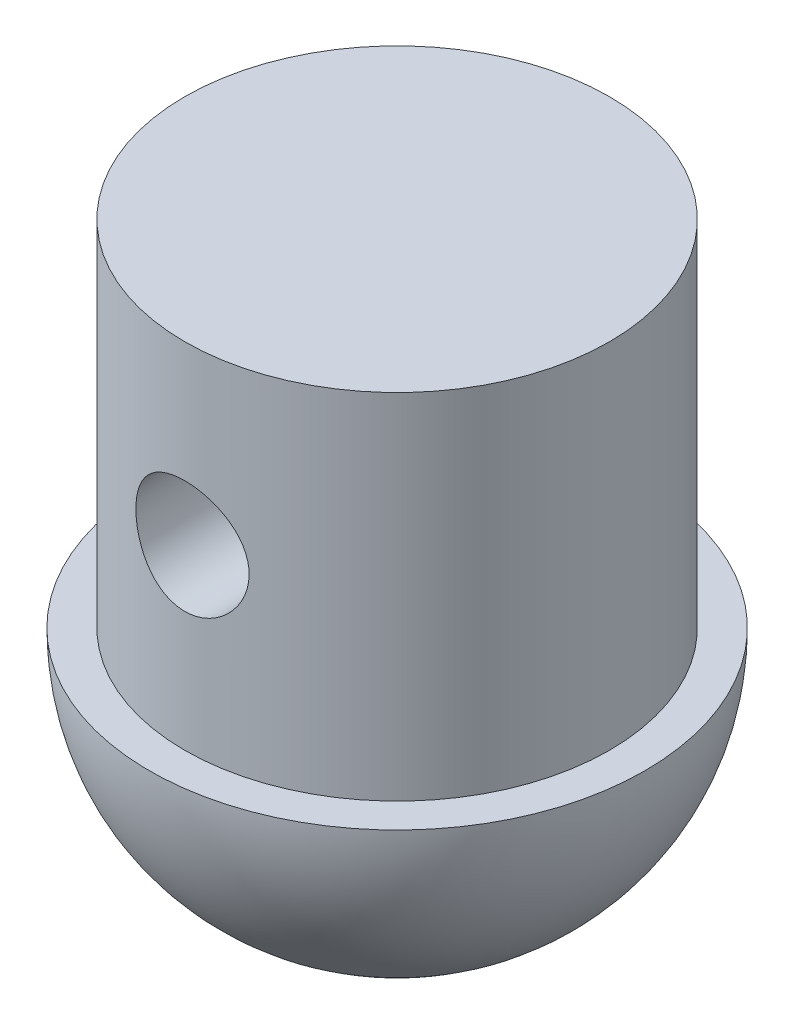
ISO-10303-21;
HEADER;
FILE_DESCRIPTION(('STEP AP214'),'2;1');
FILE_NAME('part.step','',(''),(''),'','','');
FILE_SCHEMA(('AUTOMOTIVE_DESIGN { 1 0 10303 214 1 1 1 1 }'));
ENDSEC;
DATA;
#1=APPLICATION_CONTEXT('core data for automotive mechanical design processes');
#2=APPLICATION_PROTOCOL_DEFINITION('international standard','automotive_design',2000,#1);
#3=PRODUCT_CONTEXT('',#1,'mechanical');
#4=PRODUCT('Part','Part','',(#3));
#5=PRODUCT_RELATED_PRODUCT_CATEGORY('part','',(#4));
#6=PRODUCT_DEFINITION_FORMATION('','',#4);
#7=PRODUCT_DEFINITION_CONTEXT('part definition',#1,'design');
#8=PRODUCT_DEFINITION('design','',#6,#7);
#9=PRODUCT_DEFINITION_SHAPE('','',#8);
#10=(LENGTH_UNIT() NAMED_UNIT(*) SI_UNIT(.MILLI.,.METRE.));
#11=(NAMED_UNIT(*) PLANE_ANGLE_UNIT() SI_UNIT($,.RADIAN.));
#12=(NAMED_UNIT(*) SI_UNIT($,.STERADIAN.) SOLID_ANGLE_UNIT());
#13=UNCERTAINTY_MEASURE_WITH_UNIT(LENGTH_MEASURE(1.E-05),#10,'distance_accuracy_value','');
#14=(GEOMETRIC_REPRESENTATION_CONTEXT(3) GLOBAL_UNCERTAINTY_ASSIGNED_CONTEXT((#13)) GLOBAL_UNIT_ASSIGNED_CONTEXT((#10,
#11,#12)) REPRESENTATION_CONTEXT('',''));
#15=CARTESIAN_POINT('',(0.,0.,0.));
#16=DIRECTION('',(0.,0.,1.));
#17=DIRECTION('',(1.,0.,0.));
#18=AXIS2_PLACEMENT_3D('',#15,#16,#17);
#19=CARTESIAN_POINT('',(0.,0.,0.));
#20=DIRECTION('',(0.,1.,0.));
#21=DIRECTION('',(1.,0.,0.));
#22=AXIS2_PLACEMENT_3D('',#19,#20,#21);
#23=SPHERICAL_SURFACE('',#22,7.);
#24=CARTESIAN_POINT('',(0.,0.,0.));
#25=DIRECTION('',(-0.915664164822438,0.401944196699029,0.));
#26=DIRECTION('',(-0.401944196699029,-0.915664164822438,0.));
#27=AXIS2_PLACEMENT_3D('',#24,#25,#26);
#28=SPHERICAL_SURFACE('',#27,7.);
#29=CARTESIAN_POINT('',(-6.28184853391924,2.75750942294523,0.));
#30=DIRECTION('',(-0.915664164822438,0.401944196699029,0.));
#31=DIRECTION('',(-0.401944196699029,-0.915664164822438,0.));
#32=AXIS2_PLACEMENT_3D('',#29,#30,#31);
#33=CIRCLE('',#32,1.39087051132196);
#34=CARTESIAN_POINT('',(-6.84090086430491,1.48393913781945,0.));
#35=VERTEX_POINT('',#34);
#36=EDGE_CURVE('E11',#35,#35,#33,.T.);
#37=ORIENTED_EDGE('',*,*,#36,.T.);
#38=EDGE_LOOP('',(#37));
#39=FACE_BOUND('',#38,.T.);
#40=ADVANCED_FACE('F40',(#39),#28,.T.);
#41=CARTESIAN_POINT('',(-4.44764178502422,6.93599341309035,-7.));
#42=DIRECTION('',(-0.915664164822438,0.401944196699029,0.));
#43=DIRECTION('',(-0.401944196699029,-0.915664164822438,0.));
#44=AXIS2_PLACEMENT_3D('',#41,#42,#43);
#45=PLANE('',#44);
#46=ORIENTED_EDGE('',*,*,#36,.F.);
#47=EDGE_LOOP('',(#46));
#48=FACE_BOUND('',#47,.T.);
#49=ADVANCED_FACE('F48',(#48),#45,.F.);
#50=CLOSED_SHELL('',(#40,#49));
#51=MANIFOLD_SOLID_BREP('B2',#50);
#52=CARTESIAN_POINT('',(0.,0.,0.));
#53=DIRECTION('',(0.,1.,0.));
#54=DIRECTION('',(1.,0.,0.));
#55=AXIS2_PLACEMENT_3D('',#52,#53,#54);
#56=SPHERICAL_SURFACE('',#55,7.);
#57=CARTESIAN_POINT('',(0.,0.,0.));
#58=DIRECTION('',(0.,-1.,0.));
#59=DIRECTION('',(0.,0.,-1.));
#60=AXIS2_PLACEMENT_3D('',#57,#58,#59);
#61=CIRCLE('',#60,7.);
#62=CARTESIAN_POINT('',(0.,0.,-7.));
#63=VERTEX_POINT('',#62);
#64=EDGE_CURVE('E76',#63,#63,#61,.T.);
#65=ORIENTED_EDGE('',*,*,#64,.T.);
#66=EDGE_LOOP('',(#65));
#67=FACE_BOUND('',#66,.T.);
#68=ADVANCED_FACE('F65',(#67),#56,.T.);
#69=CARTESIAN_POINT('',(-7.49229768381106,0.,-7.));
#70=DIRECTION('',(0.,-1.,0.));
#71=DIRECTION('',(0.,0.,-1.));
#72=AXIS2_PLACEMENT_3D('',#69,#70,#71);
#73=PLANE('',#72);
#74=CARTESIAN_POINT('',(0.,0.,0.));
#75=DIRECTION('',(0.,-1.,0.));
#76=DIRECTION('',(0.,0.,-1.));
#77=AXIS2_PLACEMENT_3D('',#74,#75,#76);
#78=CIRCLE('',#77,6.);
#79=CARTESIAN_POINT('',(0.,0.,-6.));
#80=VERTEX_POINT('',#79);
#81=EDGE_CURVE('E39',#80,#80,#78,.F.);
#82=ORIENTED_EDGE('',*,*,#81,.F.);
#83=EDGE_LOOP('',(#82));
#84=FACE_BOUND('',#83,.T.);
#85=ORIENTED_EDGE('',*,*,#64,.F.);
#86=EDGE_LOOP('',(#85));
#87=FACE_BOUND('',#86,.T.);
#88=ADVANCED_FACE('F102',(#84,#87),#73,.F.);
#89=CARTESIAN_POINT('',(0.,10.,0.));
#90=DIRECTION('',(0.,-1.,0.));
#91=DIRECTION('',(0.,0.,-1.));
#92=AXIS2_PLACEMENT_3D('',#89,#90,#91);
#93=CYLINDRICAL_SURFACE('',#92,6.);
#94=CARTESIAN_POINT('',(0.,6.6,-6.));
#95=CARTESIAN_POINT('',(-0.0882036446662835,6.59999790645212,-5.9999986704813));
#96=CARTESIAN_POINT('',(-0.176429728177472,6.59268190864826,-5.99803588929723));
#97=CARTESIAN_POINT('',(-0.350340361083571,6.56366301540905,-5.99039658897325));
#98=CARTESIAN_POINT('',(-0.436023666655269,6.54195319645911,-5.98471828266059));
#99=CARTESIAN_POINT('',(-0.60231327123625,6.48490266650877,-5.97027466602242));
#100=CARTESIAN_POINT('',(-0.682925960812229,6.44957952986717,-5.96151333704337));
#101=CARTESIAN_POINT('',(-0.837082949114126,6.36637020586672,-5.94182959321305));
#102=CARTESIAN_POINT('',(-0.910626776359695,6.31848318131261,-5.93090703436005));
#103=CARTESIAN_POINT('',(-1.05026360299202,6.21033318686926,-5.90779691921738));
#104=CARTESIAN_POINT('',(-1.11616935189025,6.14983306559322,-5.8955877414348));
#105=CARTESIAN_POINT('',(-1.23702970928508,6.01868121354948,-5.87141927743138));
#106=CARTESIAN_POINT('',(-1.29198290796523,5.94802817790661,-5.85946002355797));
#107=CARTESIAN_POINT('',(-1.39029127394741,5.797081412139,-5.83692429973529));
#108=CARTESIAN_POINT('',(-1.43343102189222,5.71664293738822,-5.82637510858234));
#109=CARTESIAN_POINT('',(-1.50550038461563,5.54932791112846,-5.80817181846909));
#110=CARTESIAN_POINT('',(-1.53443261960976,5.46245255014382,-5.8005171857408));
#111=CARTESIAN_POINT('',(-1.5766153618114,5.28680356973868,-5.78919292669855));
#112=CARTESIAN_POINT('',(-1.59020536195949,5.19811716803828,-5.78543718352246));
#113=CARTESIAN_POINT('',(-1.60237627764874,5.01964985333367,-5.78207864835752));
#114=CARTESIAN_POINT('',(-1.60095999764589,4.92986914797151,-5.78247508038722));
#115=CARTESIAN_POINT('',(-1.58342808002097,4.7544116677021,-5.78729903015237));
#116=CARTESIAN_POINT('',(-1.56772324851795,4.66869025436957,-5.79161388402152));
#117=CARTESIAN_POINT('',(-1.52271798977763,4.50114533243464,-5.80360810471625));
#118=CARTESIAN_POINT('',(-1.493416475944,4.41932213593963,-5.81128774043995));
#119=CARTESIAN_POINT('',(-1.421714855722,4.26082548495324,-5.82924529396782));
#120=CARTESIAN_POINT('',(-1.37917072910226,4.18422052857102,-5.83955154254446));
#121=CARTESIAN_POINT('',(-1.28229203059023,4.03909267291875,-5.86158583714473));
#122=CARTESIAN_POINT('',(-1.22795513779401,3.97057136867482,-5.8733141628429));
#123=CARTESIAN_POINT('',(-1.10693285810735,3.84120880203617,-5.89734008503746));
#124=CARTESIAN_POINT('',(-1.03990250182639,3.78069094534804,-5.90964377191026));
#125=CARTESIAN_POINT('',(-0.896494134565098,3.67168897571977,-5.93309105021092));
#126=CARTESIAN_POINT('',(-0.820115755364072,3.62320533703806,-5.94423459590854));
#127=CARTESIAN_POINT('',(-0.659678604397961,3.53950567774028,-5.96417456318624));
#128=CARTESIAN_POINT('',(-0.575587922041431,3.50434818364113,-5.97296058266845));
#129=CARTESIAN_POINT('',(-0.402401835512316,3.4487622489493,-5.98712035520802));
#130=CARTESIAN_POINT('',(-0.313307529542658,3.42833058982083,-5.99249485386999));
#131=CARTESIAN_POINT('',(-0.135403266516412,3.40328409846574,-5.99911326846707));
#132=CARTESIAN_POINT('',(-0.0466593901131037,3.39822956811931,-6.00047197976769));
#133=CARTESIAN_POINT('',(0.130408036720958,3.40286653139755,-5.99923577353354));
#134=CARTESIAN_POINT('',(0.218731629649689,3.41255650088461,-5.99664126464274));
#135=CARTESIAN_POINT('',(0.390881959921425,3.44604675796799,-5.98786428396825));
#136=CARTESIAN_POINT('',(0.474759881622232,3.46960179695823,-5.98174421237093));
#137=CARTESIAN_POINT('',(0.637365576940845,3.52986875560634,-5.96661035915282));
#138=CARTESIAN_POINT('',(0.716092791372797,3.56658210100036,-5.9575962639682));
#139=CARTESIAN_POINT('',(0.867870779734386,3.6529391097445,-5.93740528447735));
#140=CARTESIAN_POINT('',(0.94078015076904,3.70282197343847,-5.92618949284386));
#141=CARTESIAN_POINT('',(1.07734770831762,3.81380130412612,-5.9028916189203));
#142=CARTESIAN_POINT('',(1.14100406303899,3.87489998607982,-5.89080936580444));
#143=CARTESIAN_POINT('',(1.25911139583055,4.0086284619967,-5.86671796694981));
#144=CARTESIAN_POINT('',(1.31325215399989,4.08153484912012,-5.85472049149563));
#145=CARTESIAN_POINT('',(1.40853752947959,4.23565175687572,-5.83253157740069));
#146=CARTESIAN_POINT('',(1.44968268897221,4.31686193088299,-5.82234006342218));
#147=CARTESIAN_POINT('',(1.51749929269189,4.48487624567057,-5.80503414721321));
#148=CARTESIAN_POINT('',(1.54425449804718,4.5716446494985,-5.79790198738987));
#149=CARTESIAN_POINT('',(1.58272964096634,4.74867145578706,-5.78751860185751));
#150=CARTESIAN_POINT('',(1.5944534208239,4.83892896029366,-5.78426638438256));
#151=CARTESIAN_POINT('',(1.60231191722602,5.01719583029804,-5.78209395637349));
#152=CARTESIAN_POINT('',(1.59894524494388,5.10518185620422,-5.78303518188826));
#153=CARTESIAN_POINT('',(1.5778750080045,5.27928281121043,-5.78881916870635));
#154=CARTESIAN_POINT('',(1.56017181228047,5.36539778840111,-5.79366182961091));
#155=CARTESIAN_POINT('',(1.51122012559733,5.53268460170324,-5.80662056856999));
#156=CARTESIAN_POINT('',(1.48007728860457,5.61388947418558,-5.81471108015306));
#157=CARTESIAN_POINT('',(1.40521243649916,5.76998306442748,-5.83325454509352));
#158=CARTESIAN_POINT('',(1.36148844819695,5.84487078904044,-5.84370786897202));
#159=CARTESIAN_POINT('',(1.26119127415051,5.98858428759724,-5.86618337152254));
#160=CARTESIAN_POINT('',(1.20427783814327,6.05716682798096,-5.87824266481322));
#161=CARTESIAN_POINT('',(1.0798644280888,6.18396996133387,-5.90236403026437));
#162=CARTESIAN_POINT('',(1.012361883487,6.24218803093508,-5.91442610238761));
#163=CARTESIAN_POINT('',(0.866943984870946,6.34783379011748,-5.93750249923166));
#164=CARTESIAN_POINT('',(0.788836769401423,6.39500400851946,-5.94848889051638));
#165=CARTESIAN_POINT('',(0.625510912333512,6.47546993274349,-5.9678704808232));
#166=CARTESIAN_POINT('',(0.540296875757037,6.50877454053088,-5.97626734146876));
#167=CARTESIAN_POINT('',(0.379499763904792,6.55622022833241,-5.98843802010774));
#168=CARTESIAN_POINT('',(0.304609613252028,6.572599506874,-5.99274216474082));
#169=CARTESIAN_POINT('',(0.15315183625366,6.59448976493365,-5.99852359229165));
#170=CARTESIAN_POINT('',(0.0765843763238879,6.60000181776002,-6.00000115437816));
#171=CARTESIAN_POINT('',(0.,6.6,-6.));
#172=B_SPLINE_CURVE_WITH_KNOTS('',3,(#94,#95,#96,#97,#98,#99,#100,#101,#102,#103,#104,#105,#106,
#107,#108,#109,#110,#111,#112,#113,#114,#115,#116,#117,#118,#119,#120,#121,#122,#123,#124,#125,
#126,#127,#128,#129,#130,#131,#132,#133,#134,#135,#136,#137,#138,#139,#140,#141,#142,#143,#144,
#145,#146,#147,#148,#149,#150,#151,#152,#153,#154,#155,#156,#157,#158,#159,#160,#161,#162,#163,
#164,#165,#166,#167,#168,#169,#170,#171),.UNSPECIFIED.,.T.,.F.,(4,2,2,2,2,2,2,2,2,2,2,2,2,2,2,2,
2,2,2,2,2,2,2,2,2,2,2,2,2,2,2,2,2,2,2,2,2,2,4),(0.,0.264330079159655,0.52878739500916,
0.792904442377546,1.0570390936694,1.32667918363974,1.59635395940119,1.87066066018583,
2.1449167530376,2.41297726598071,2.68098768318787,2.94152801632129,3.20208917445683,
3.4655893867253,3.72914150489435,4.00129007845189,4.27344937545409,4.54679047677765,
4.82007181747443,5.08546174014969,5.35082423135612,5.61162828509024,5.87246060615823,
6.13840228798972,6.40439654602441,6.67789197101562,6.95137598414617,7.2232503815319,
7.49505526923061,7.75794673914764,8.0208314440835,8.28168612350517,8.54258173690277,
8.81115471648986,9.07979299457834,9.35417801816593,9.62838660908019,9.85791855186544,
10.0874278236498),.UNSPECIFIED.);
#173=CARTESIAN_POINT('',(0.,6.6,-6.));
#174=VERTEX_POINT('',#173);
#175=EDGE_CURVE('E68',#174,#174,#172,.T.);
#176=ORIENTED_EDGE('',*,*,#175,.T.);
#177=EDGE_LOOP('',(#176));
#178=FACE_BOUND('',#177,.T.);
#179=CARTESIAN_POINT('',(1.6,5.,5.78273291792039));
#180=CARTESIAN_POINT('',(1.59999787452612,4.91185924980899,5.7827344455633));
#181=CARTESIAN_POINT('',(1.59269194579771,4.82369599961951,5.78477011639344));
#182=CARTESIAN_POINT('',(1.56371666608212,4.64991566275457,5.79266848924472));
#183=CARTESIAN_POINT('',(1.54204010896768,4.56429987601746,5.79853311126453));
#184=CARTESIAN_POINT('',(1.48508676448053,4.39815354404267,5.81337900141366));
#185=CARTESIAN_POINT('',(1.4498291003374,4.31761603293728,5.82235588547335));
#186=CARTESIAN_POINT('',(1.36677427650964,4.16358660795211,5.8424092393635));
#187=CARTESIAN_POINT('',(1.3189761427316,4.0900952419944,5.85348587227547));
#188=CARTESIAN_POINT('',(1.21091878299647,3.95040596240983,5.87680111642766));
#189=CARTESIAN_POINT('',(1.15040238003367,3.88441038602843,5.88906032893152));
#190=CARTESIAN_POINT('',(1.01917941827217,3.76337473843904,5.91318161149208));
#191=CARTESIAN_POINT('',(0.948471804277315,3.70833580308656,5.92504364026752));
#192=CARTESIAN_POINT('',(0.797470536698616,3.60993204927766,5.94726390774734));
#193=CARTESIAN_POINT('',(0.717041455903584,3.56676838509372,5.95759501009834));
#194=CARTESIAN_POINT('',(0.549746435783273,3.49465229170619,5.97535300969467));
#195=CARTESIAN_POINT('',(0.462881584700083,3.46569746617476,5.9827803966101));
#196=CARTESIAN_POINT('',(0.287292769448073,3.42347582381139,5.99374842861169));
#197=CARTESIAN_POINT('',(0.198656979360733,3.40986481869927,5.99737421400212));
#198=CARTESIAN_POINT('',(0.0202908428068611,3.39763430391426,6.000628196942));
#199=CARTESIAN_POINT('',(-0.0694393179508233,3.39901228509589,6.00025706357286));
#200=CARTESIAN_POINT('',(-0.245051389689077,3.41647825003158,5.99562140687813));
#201=CARTESIAN_POINT('',(-0.330973280576888,3.43219436610903,5.99145531221602));
#202=CARTESIAN_POINT('',(-0.498913052456843,3.47728971022556,5.97981398872374));
#203=CARTESIAN_POINT('',(-0.580930710544464,3.50666971734884,5.97233857120463));
#204=CARTESIAN_POINT('',(-0.739683156118043,3.5785438780739,5.95477255279922));
#205=CARTESIAN_POINT('',(-0.816357349063631,3.62116544568056,5.94465670302171));
#206=CARTESIAN_POINT('',(-0.961591999011611,3.71821505560728,5.9228997480757));
#207=CARTESIAN_POINT('',(-1.03015087046869,3.77264539922253,5.91125834578275));
#208=CARTESIAN_POINT('',(-1.15942829557249,3.89374148634714,5.88729018351104));
#209=CARTESIAN_POINT('',(-1.21984153614219,3.96073155603951,5.87495335495478));
#210=CARTESIAN_POINT('',(-1.32865065683815,4.10401974099102,5.85130724018329));
#211=CARTESIAN_POINT('',(-1.37704580423844,4.18031842336025,5.83999801664631));
#212=CARTESIAN_POINT('',(-1.46067743349021,4.34072008145716,5.81964721826454));
#213=CARTESIAN_POINT('',(-1.49583093280429,4.42486828073093,5.81062005680583));
#214=CARTESIAN_POINT('',(-1.55139201348531,4.59818119956356,5.79603460063156));
#215=CARTESIAN_POINT('',(-1.57180325169042,4.68734466915873,5.79047544571885));
#216=CARTESIAN_POINT('',(-1.59677405674218,4.86530176881729,5.78363868515234));
#217=CARTESIAN_POINT('',(-1.60178906096974,4.95402683888858,5.78223810662157));
#218=CARTESIAN_POINT('',(-1.597079848984,5.13104781824197,5.78354062803713));
#219=CARTESIAN_POINT('',(-1.58735720137773,5.21934377219377,5.78624329125356));
#220=CARTESIAN_POINT('',(-1.55385017495931,5.39124527527808,5.79532899431386));
#221=CARTESIAN_POINT('',(-1.53033958330325,5.47490835035108,5.80164031753083));
#222=CARTESIAN_POINT('',(-1.47023189380392,5.63710370508665,5.81716215168585));
#223=CARTESIAN_POINT('',(-1.43363308701324,5.71563531314159,5.82637304120572));
#224=CARTESIAN_POINT('',(-1.34746324406962,5.86724396594853,5.84690857976629));
#225=CARTESIAN_POINT('',(-1.29762476190339,5.94016318071188,5.8582752389782));
#226=CARTESIAN_POINT('',(-1.18672182390013,6.07677064136243,5.88174273547405));
#227=CARTESIAN_POINT('',(-1.12565525778373,6.14045714796329,5.89384371048319));
#228=CARTESIAN_POINT('',(-0.991923026003871,6.25868197859996,5.91783971907433));
#229=CARTESIAN_POINT('',(-0.918973132807077,6.31290270158287,5.92971869219044));
#230=CARTESIAN_POINT('',(-0.764742748752595,6.40832878992841,5.95157336013737));
#231=CARTESIAN_POINT('',(-0.683462701615108,6.44953484806313,5.96154915626333));
#232=CARTESIAN_POINT('',(-0.515451307860698,6.51738370588921,5.978409207194));
#233=CARTESIAN_POINT('',(-0.428766282305869,6.54413521555477,5.98531646784308));
#234=CARTESIAN_POINT('',(-0.251919507785059,6.58263098245149,5.99536243029798));
#235=CARTESIAN_POINT('',(-0.161758533856201,6.59437856541975,5.99850196723977));
#236=CARTESIAN_POINT('',(0.0165136010769233,6.60232465899314,6.0006193075016));
#237=CARTESIAN_POINT('',(0.104602809222308,6.59898905530491,5.99972181030494));
#238=CARTESIAN_POINT('',(0.278918643704555,6.57794520513986,5.9941479278306));
#239=CARTESIAN_POINT('',(0.365145339850183,6.56023749830647,5.98947168443723));
#240=CARTESIAN_POINT('',(0.532728098771435,6.51121551606502,5.97689048312844));
#241=CARTESIAN_POINT('',(0.614113609481483,6.47999576522167,5.96900797751776));
#242=CARTESIAN_POINT('',(0.770537678776833,6.40492031860338,5.95083853212803));
#243=CARTESIAN_POINT('',(0.845575345328785,6.36106285071116,5.9405512551794));
#244=CARTESIAN_POINT('',(0.989342614939896,6.26059338228894,5.91833064980799));
#245=CARTESIAN_POINT('',(1.05785068939027,6.20367249543562,5.90636074702983));
#246=CARTESIAN_POINT('',(1.18450029724544,6.07927780051353,5.88227200056129));
#247=CARTESIAN_POINT('',(1.24263909793084,6.0118012193649,5.87015311850574));
#248=CARTESIAN_POINT('',(1.34816560187261,5.86642528332748,5.84683167732792));
#249=CARTESIAN_POINT('',(1.39528875413901,5.7883293490008,5.83565513061492));
#250=CARTESIAN_POINT('',(1.47566951228968,5.62503495123749,5.81585115203583));
#251=CARTESIAN_POINT('',(1.50893618695116,5.53984117714822,5.80722205399804));
#252=CARTESIAN_POINT('',(1.5563049940103,5.37913493117279,5.79468800506476));
#253=CARTESIAN_POINT('',(1.57265214719335,5.30431898835834,5.79024112213281));
#254=CARTESIAN_POINT('',(1.59449995435361,5.15300755360111,5.78426308173731));
#255=CARTESIAN_POINT('',(1.60000184505801,5.07651225416789,5.7827315918209));
#256=CARTESIAN_POINT('',(1.6,5.,5.78273291792039));
#257=B_SPLINE_CURVE_WITH_KNOTS('',3,(#179,#180,#181,#182,#183,#184,#185,#186,#187,#188,#189,
#190,#191,#192,#193,#194,#195,#196,#197,#198,#199,#200,#201,#202,#203,#204,#205,#206,#207,#208,
#209,#210,#211,#212,#213,#214,#215,#216,#217,#218,#219,#220,#221,#222,#223,#224,#225,#226,#227,
#228,#229,#230,#231,#232,#233,#234,#235,#236,#237,#238,#239,#240,#241,#242,#243,#244,#245,#246,
#247,#248,#249,#250,#251,#252,#253,#254,#255,#256),.UNSPECIFIED.,.T.,.F.,(4,2,2,2,2,2,2,2,2,2,2,
2,2,2,2,2,2,2,2,2,2,2,2,2,2,2,2,2,2,2,2,2,2,2,2,2,2,2,4),(0.,0.264140902492821,
0.528414358280161,0.792317049276934,1.05624024524884,1.32612732904169,1.59604237699569,
1.87028165896643,2.14447467443397,2.41238643453184,2.68025334708482,2.94136456640643,
3.20249067552556,3.46621159124456,3.72998394715593,4.00185409840264,4.27374082111663,
4.54730412077229,4.82079953934806,5.08612267391536,5.35141757070658,5.61161480341915,
5.87184602287714,6.13779707970073,6.40379817229035,6.67748725563562,6.95116176802338,
7.22274831668976,7.4942746556306,7.75747243929026,8.02066034086225,8.28203611890788,
8.54344856608626,8.81183083189117,9.08028372300693,9.35464031183427,9.6288170567485,
9.85813574131029,10.0874282742632),.UNSPECIFIED.);
#258=CARTESIAN_POINT('',(1.6,5.,5.78273291792039));
#259=VERTEX_POINT('',#258);
#260=EDGE_CURVE('E84',#259,#259,#257,.T.);
#261=ORIENTED_EDGE('',*,*,#260,.T.);
#262=EDGE_LOOP('',(#261));
#263=FACE_BOUND('',#262,.T.);
#264=CARTESIAN_POINT('',(0.,10.,0.));
#265=DIRECTION('',(0.,1.,0.));
#266=DIRECTION('',(0.,0.,1.));
#267=AXIS2_PLACEMENT_3D('',#264,#265,#266);
#268=CIRCLE('',#267,6.);
#269=CARTESIAN_POINT('',(0.,10.,6.));
#270=VERTEX_POINT('',#269);
#271=EDGE_CURVE('E81',#270,#270,#268,.T.);
#272=ORIENTED_EDGE('',*,*,#271,.F.);
#273=EDGE_LOOP('',(#272));
#274=FACE_BOUND('',#273,.T.);
#275=ORIENTED_EDGE('',*,*,#81,.T.);
#276=EDGE_LOOP('',(#275));
#277=FACE_BOUND('',#276,.T.);
#278=ADVANCED_FACE('F88',(#178,#263,#274,#277),#93,.T.);
#279=CARTESIAN_POINT('',(0.,10.,0.));
#280=DIRECTION('',(0.,1.,0.));
#281=DIRECTION('',(0.,0.,1.));
#282=AXIS2_PLACEMENT_3D('',#279,#280,#281);
#283=PLANE('',#282);
#284=ORIENTED_EDGE('',*,*,#271,.T.);
#285=EDGE_LOOP('',(#284));
#286=FACE_BOUND('',#285,.T.);
#287=ADVANCED_FACE('F94',(#286),#283,.T.);
#288=CARTESIAN_POINT('',(0.,5.,-7.));
#289=DIRECTION('',(0.,0.,1.));
#290=DIRECTION('',(1.,0.,0.));
#291=AXIS2_PLACEMENT_3D('',#288,#289,#290);
#292=CYLINDRICAL_SURFACE('',#291,1.6);
#293=ORIENTED_EDGE('',*,*,#260,.F.);
#294=EDGE_LOOP('',(#293));
#295=FACE_BOUND('',#294,.T.);
#296=ORIENTED_EDGE('',*,*,#175,.F.);
#297=EDGE_LOOP('',(#296));
#298=FACE_BOUND('',#297,.T.);
#299=ADVANCED_FACE('F91',(#295,#298),#292,.F.);
#300=CLOSED_SHELL('',(#68,#88,#278,#287,#299));
#301=MANIFOLD_SOLID_BREP('B6',#300);
#302=ADVANCED_BREP_SHAPE_REPRESENTATION('',(#18,#51,#301),#14);
#303=SHAPE_DEFINITION_REPRESENTATION(#9,#302);
ENDSEC;
END-ISO-10303-21;
